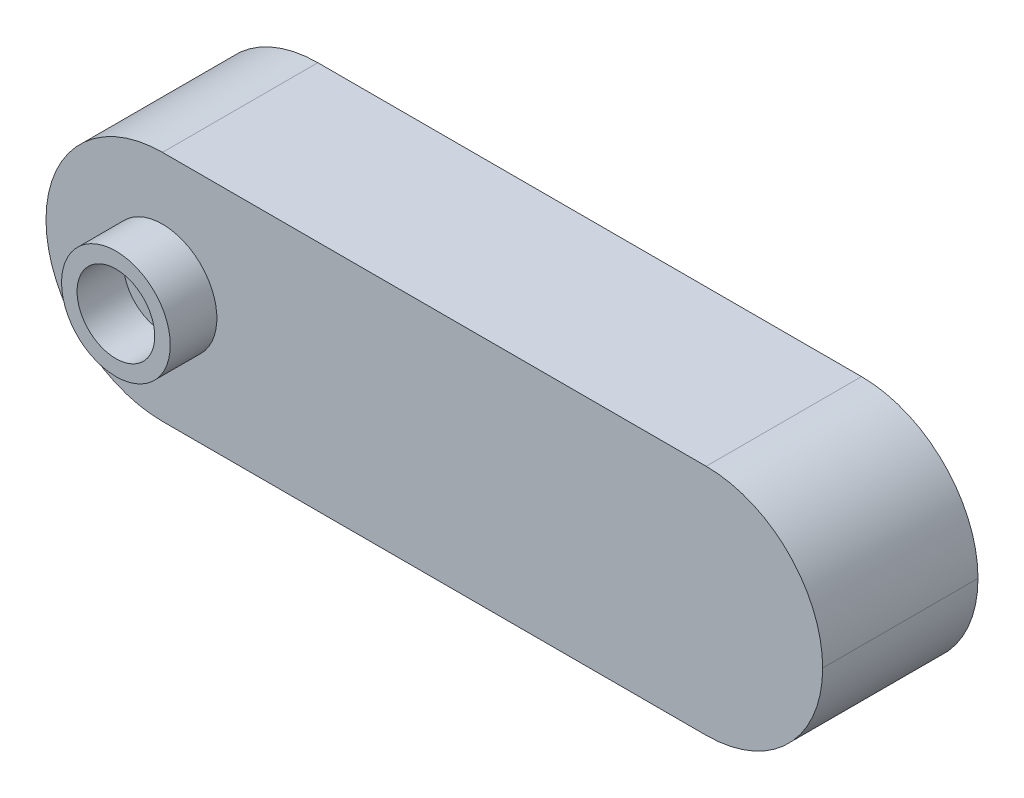
ISO-10303-21;
HEADER;
FILE_DESCRIPTION(('STEP AP214'),'2;1');
FILE_NAME('part.step','',(''),(''),'','','');
FILE_SCHEMA(('AUTOMOTIVE_DESIGN { 1 0 10303 214 1 1 1 1 }'));
ENDSEC;
DATA;
#1=APPLICATION_CONTEXT('core data for automotive mechanical design processes');
#2=APPLICATION_PROTOCOL_DEFINITION('international standard','automotive_design',2000,#1);
#3=PRODUCT_CONTEXT('',#1,'mechanical');
#4=PRODUCT('Part','Part','',(#3));
#5=PRODUCT_RELATED_PRODUCT_CATEGORY('part','',(#4));
#6=PRODUCT_DEFINITION_FORMATION('','',#4);
#7=PRODUCT_DEFINITION_CONTEXT('part definition',#1,'design');
#8=PRODUCT_DEFINITION('design','',#6,#7);
#9=PRODUCT_DEFINITION_SHAPE('','',#8);
#10=(LENGTH_UNIT() NAMED_UNIT(*) SI_UNIT(.MILLI.,.METRE.));
#11=(NAMED_UNIT(*) PLANE_ANGLE_UNIT() SI_UNIT($,.RADIAN.));
#12=(NAMED_UNIT(*) SI_UNIT($,.STERADIAN.) SOLID_ANGLE_UNIT());
#13=UNCERTAINTY_MEASURE_WITH_UNIT(LENGTH_MEASURE(1.E-05),#10,'distance_accuracy_value','');
#14=(GEOMETRIC_REPRESENTATION_CONTEXT(3) GLOBAL_UNCERTAINTY_ASSIGNED_CONTEXT((#13)) GLOBAL_UNIT_ASSIGNED_CONTEXT((#10,
#11,#12)) REPRESENTATION_CONTEXT('',''));
#15=CARTESIAN_POINT('',(0.,0.,0.));
#16=DIRECTION('',(0.,0.,1.));
#17=DIRECTION('',(1.,0.,0.));
#18=AXIS2_PLACEMENT_3D('',#15,#16,#17);
#19=CARTESIAN_POINT('',(0.,0.,10.));
#20=DIRECTION('',(0.,1.,0.));
#21=DIRECTION('',(0.,0.,1.));
#22=AXIS2_PLACEMENT_3D('',#19,#20,#21);
#23=PLANE('',#22);
#24=DIRECTION('',(1.,0.,0.));
#25=VECTOR('',#24,1.);
#26=CARTESIAN_POINT('',(0.,0.,0.));
#27=LINE('',#26,#25);
#28=CARTESIAN_POINT('',(7.5,0.,0.));
#29=VERTEX_POINT('',#28);
#30=CARTESIAN_POINT('',(42.5,0.,0.));
#31=VERTEX_POINT('',#30);
#32=EDGE_CURVE('E105',#29,#31,#27,.T.);
#33=ORIENTED_EDGE('',*,*,#32,.T.);
#34=DIRECTION('',(0.,0.,-1.));
#35=VECTOR('',#34,1.);
#36=CARTESIAN_POINT('',(42.5,0.,10.));
#37=LINE('',#36,#35);
#38=CARTESIAN_POINT('',(42.5,0.,10.));
#39=VERTEX_POINT('',#38);
#40=EDGE_CURVE('E148',#31,#39,#37,.F.);
#41=ORIENTED_EDGE('',*,*,#40,.T.);
#42=DIRECTION('',(1.,0.,0.));
#43=VECTOR('',#42,1.);
#44=CARTESIAN_POINT('',(0.,0.,10.));
#45=LINE('',#44,#43);
#46=CARTESIAN_POINT('',(7.5,0.,10.));
#47=VERTEX_POINT('',#46);
#48=EDGE_CURVE('E163',#47,#39,#45,.T.);
#49=ORIENTED_EDGE('',*,*,#48,.F.);
#50=DIRECTION('',(0.,0.,-1.));
#51=VECTOR('',#50,1.);
#52=CARTESIAN_POINT('',(7.5,0.,10.));
#53=LINE('',#52,#51);
#54=EDGE_CURVE('E152',#47,#29,#53,.T.);
#55=ORIENTED_EDGE('',*,*,#54,.T.);
#56=EDGE_LOOP('',(#33,#41,#49,#55));
#57=FACE_BOUND('',#56,.T.);
#58=ADVANCED_FACE('F45',(#57),#23,.F.);
#59=CARTESIAN_POINT('',(0.,15.,10.));
#60=DIRECTION('',(0.,-1.,0.));
#61=DIRECTION('',(0.,0.,-1.));
#62=AXIS2_PLACEMENT_3D('',#59,#60,#61);
#63=PLANE('',#62);
#64=DIRECTION('',(-1.,0.,0.));
#65=VECTOR('',#64,1.);
#66=CARTESIAN_POINT('',(0.,15.,10.));
#67=LINE('',#66,#65);
#68=CARTESIAN_POINT('',(42.5,15.,10.));
#69=VERTEX_POINT('',#68);
#70=CARTESIAN_POINT('',(7.5,15.,10.));
#71=VERTEX_POINT('',#70);
#72=EDGE_CURVE('E119',#69,#71,#67,.T.);
#73=ORIENTED_EDGE('',*,*,#72,.F.);
#74=DIRECTION('',(0.,0.,-1.));
#75=VECTOR('',#74,1.);
#76=CARTESIAN_POINT('',(42.5,15.,10.));
#77=LINE('',#76,#75);
#78=CARTESIAN_POINT('',(42.5,15.,0.));
#79=VERTEX_POINT('',#78);
#80=EDGE_CURVE('E54',#69,#79,#77,.T.);
#81=ORIENTED_EDGE('',*,*,#80,.T.);
#82=DIRECTION('',(-1.,0.,0.));
#83=VECTOR('',#82,1.);
#84=CARTESIAN_POINT('',(0.,15.,0.));
#85=LINE('',#84,#83);
#86=CARTESIAN_POINT('',(7.5,15.,0.));
#87=VERTEX_POINT('',#86);
#88=EDGE_CURVE('E160',#79,#87,#85,.T.);
#89=ORIENTED_EDGE('',*,*,#88,.T.);
#90=DIRECTION('',(0.,0.,-1.));
#91=VECTOR('',#90,1.);
#92=CARTESIAN_POINT('',(7.5,15.,10.));
#93=LINE('',#92,#91);
#94=EDGE_CURVE('E61',#87,#71,#93,.F.);
#95=ORIENTED_EDGE('',*,*,#94,.T.);
#96=EDGE_LOOP('',(#73,#81,#89,#95));
#97=FACE_BOUND('',#96,.T.);
#98=ADVANCED_FACE('F196',(#97),#63,.F.);
#99=CARTESIAN_POINT('',(0.,0.,10.));
#100=DIRECTION('',(0.,0.,-1.));
#101=DIRECTION('',(-1.,0.,0.));
#102=AXIS2_PLACEMENT_3D('',#99,#100,#101);
#103=PLANE('',#102);
#104=CARTESIAN_POINT('',(7.5,7.5,10.));
#105=DIRECTION('',(0.,0.,-1.));
#106=DIRECTION('',(-1.,0.,0.));
#107=AXIS2_PLACEMENT_3D('',#104,#105,#106);
#108=CIRCLE('',#107,3.5);
#109=CARTESIAN_POINT('',(4.,7.5,10.));
#110=VERTEX_POINT('',#109);
#111=EDGE_CURVE('E11',#110,#110,#108,.F.);
#112=ORIENTED_EDGE('',*,*,#111,.F.);
#113=EDGE_LOOP('',(#112));
#114=FACE_BOUND('',#113,.T.);
#115=ORIENTED_EDGE('',*,*,#48,.T.);
#116=CARTESIAN_POINT('',(42.5,7.5,10.));
#117=DIRECTION('',(0.,0.,-1.));
#118=DIRECTION('',(-1.,0.,0.));
#119=AXIS2_PLACEMENT_3D('',#116,#117,#118);
#120=CIRCLE('',#119,7.5);
#121=CARTESIAN_POINT('',(50.,7.5,10.));
#122=VERTEX_POINT('',#121);
#123=EDGE_CURVE('E138',#39,#122,#120,.F.);
#124=ORIENTED_EDGE('',*,*,#123,.T.);
#125=CARTESIAN_POINT('',(42.5,7.5,10.));
#126=DIRECTION('',(0.,0.,-1.));
#127=DIRECTION('',(-1.,0.,0.));
#128=AXIS2_PLACEMENT_3D('',#125,#126,#127);
#129=CIRCLE('',#128,7.5);
#130=EDGE_CURVE('E68',#122,#69,#129,.F.);
#131=ORIENTED_EDGE('',*,*,#130,.T.);
#132=ORIENTED_EDGE('',*,*,#72,.T.);
#133=CARTESIAN_POINT('',(7.5,7.5,10.));
#134=DIRECTION('',(0.,0.,-1.));
#135=DIRECTION('',(-1.,0.,0.));
#136=AXIS2_PLACEMENT_3D('',#133,#134,#135);
#137=CIRCLE('',#136,7.5);
#138=CARTESIAN_POINT('',(0.,7.5,10.));
#139=VERTEX_POINT('',#138);
#140=EDGE_CURVE('E145',#71,#139,#137,.F.);
#141=ORIENTED_EDGE('',*,*,#140,.T.);
#142=CARTESIAN_POINT('',(7.5,7.5,10.));
#143=DIRECTION('',(0.,0.,-1.));
#144=DIRECTION('',(-1.,0.,0.));
#145=AXIS2_PLACEMENT_3D('',#142,#143,#144);
#146=CIRCLE('',#145,7.5);
#147=EDGE_CURVE('E122',#139,#47,#146,.F.);
#148=ORIENTED_EDGE('',*,*,#147,.T.);
#149=EDGE_LOOP('',(#115,#124,#131,#132,#141,#148));
#150=FACE_BOUND('',#149,.T.);
#151=ADVANCED_FACE('F202',(#114,#150),#103,.F.);
#152=CARTESIAN_POINT('',(0.,0.,0.));
#153=DIRECTION('',(0.,0.,-1.));
#154=DIRECTION('',(-1.,0.,0.));
#155=AXIS2_PLACEMENT_3D('',#152,#153,#154);
#156=PLANE('',#155);
#157=CARTESIAN_POINT('',(42.5,7.5,0.));
#158=DIRECTION('',(0.,0.,-1.));
#159=DIRECTION('',(-1.,0.,0.));
#160=AXIS2_PLACEMENT_3D('',#157,#158,#159);
#161=CIRCLE('',#160,7.5);
#162=CARTESIAN_POINT('',(50.,7.5,0.));
#163=VERTEX_POINT('',#162);
#164=EDGE_CURVE('E111',#79,#163,#161,.T.);
#165=ORIENTED_EDGE('',*,*,#164,.T.);
#166=CARTESIAN_POINT('',(42.5,7.5,0.));
#167=DIRECTION('',(0.,0.,-1.));
#168=DIRECTION('',(-1.,0.,0.));
#169=AXIS2_PLACEMENT_3D('',#166,#167,#168);
#170=CIRCLE('',#169,7.5);
#171=EDGE_CURVE('E155',#163,#31,#170,.T.);
#172=ORIENTED_EDGE('',*,*,#171,.T.);
#173=ORIENTED_EDGE('',*,*,#32,.F.);
#174=CARTESIAN_POINT('',(7.5,7.5,0.));
#175=DIRECTION('',(0.,0.,-1.));
#176=DIRECTION('',(-1.,0.,0.));
#177=AXIS2_PLACEMENT_3D('',#174,#175,#176);
#178=CIRCLE('',#177,7.5);
#179=CARTESIAN_POINT('',(0.,7.5,0.));
#180=VERTEX_POINT('',#179);
#181=EDGE_CURVE('E99',#29,#180,#178,.T.);
#182=ORIENTED_EDGE('',*,*,#181,.T.);
#183=CARTESIAN_POINT('',(7.5,7.5,0.));
#184=DIRECTION('',(0.,0.,-1.));
#185=DIRECTION('',(-1.,0.,0.));
#186=AXIS2_PLACEMENT_3D('',#183,#184,#185);
#187=CIRCLE('',#186,7.5);
#188=EDGE_CURVE('E103',#180,#87,#187,.T.);
#189=ORIENTED_EDGE('',*,*,#188,.T.);
#190=ORIENTED_EDGE('',*,*,#88,.F.);
#191=EDGE_LOOP('',(#165,#172,#173,#182,#189,#190));
#192=FACE_BOUND('',#191,.T.);
#193=ADVANCED_FACE('F101',(#192),#156,.T.);
#194=CARTESIAN_POINT('',(42.5,7.5,10.));
#195=DIRECTION('',(0.,0.,-1.));
#196=DIRECTION('',(-1.,0.,0.));
#197=AXIS2_PLACEMENT_3D('',#194,#195,#196);
#198=CYLINDRICAL_SURFACE('',#197,7.5);
#199=ORIENTED_EDGE('',*,*,#80,.F.);
#200=ORIENTED_EDGE('',*,*,#130,.F.);
#201=DIRECTION('',(0.,0.,-1.));
#202=VECTOR('',#201,1.);
#203=CARTESIAN_POINT('',(50.,7.5,10.));
#204=LINE('',#203,#202);
#205=EDGE_CURVE('E124',#163,#122,#204,.F.);
#206=ORIENTED_EDGE('',*,*,#205,.F.);
#207=ORIENTED_EDGE('',*,*,#164,.F.);
#208=EDGE_LOOP('',(#199,#200,#206,#207));
#209=FACE_BOUND('',#208,.T.);
#210=ADVANCED_FACE('F209',(#209),#198,.T.);
#211=CARTESIAN_POINT('',(42.5,7.5,10.));
#212=DIRECTION('',(0.,0.,-1.));
#213=DIRECTION('',(-1.,0.,0.));
#214=AXIS2_PLACEMENT_3D('',#211,#212,#213);
#215=CYLINDRICAL_SURFACE('',#214,7.5);
#216=ORIENTED_EDGE('',*,*,#123,.F.);
#217=ORIENTED_EDGE('',*,*,#40,.F.);
#218=ORIENTED_EDGE('',*,*,#171,.F.);
#219=ORIENTED_EDGE('',*,*,#205,.T.);
#220=EDGE_LOOP('',(#216,#217,#218,#219));
#221=FACE_BOUND('',#220,.T.);
#222=ADVANCED_FACE('F206',(#221),#215,.T.);
#223=CARTESIAN_POINT('',(7.5,7.5,10.));
#224=DIRECTION('',(0.,0.,-1.));
#225=DIRECTION('',(-1.,0.,0.));
#226=AXIS2_PLACEMENT_3D('',#223,#224,#225);
#227=CYLINDRICAL_SURFACE('',#226,7.5);
#228=DIRECTION('',(0.,0.,-1.));
#229=VECTOR('',#228,1.);
#230=CARTESIAN_POINT('',(0.,7.5,10.));
#231=LINE('',#230,#229);
#232=EDGE_CURVE('E116',#139,#180,#231,.T.);
#233=ORIENTED_EDGE('',*,*,#232,.F.);
#234=ORIENTED_EDGE('',*,*,#140,.F.);
#235=ORIENTED_EDGE('',*,*,#94,.F.);
#236=ORIENTED_EDGE('',*,*,#188,.F.);
#237=EDGE_LOOP('',(#233,#234,#235,#236));
#238=FACE_BOUND('',#237,.T.);
#239=ADVANCED_FACE('F47',(#238),#227,.T.);
#240=CARTESIAN_POINT('',(7.5,7.5,10.));
#241=DIRECTION('',(0.,0.,-1.));
#242=DIRECTION('',(-1.,0.,0.));
#243=AXIS2_PLACEMENT_3D('',#240,#241,#242);
#244=CYLINDRICAL_SURFACE('',#243,7.5);
#245=ORIENTED_EDGE('',*,*,#147,.F.);
#246=ORIENTED_EDGE('',*,*,#232,.T.);
#247=ORIENTED_EDGE('',*,*,#181,.F.);
#248=ORIENTED_EDGE('',*,*,#54,.F.);
#249=EDGE_LOOP('',(#245,#246,#247,#248));
#250=FACE_BOUND('',#249,.T.);
#251=ADVANCED_FACE('F121',(#250),#244,.T.);
#252=CARTESIAN_POINT('',(7.5,7.5,13.));
#253=DIRECTION('',(0.,0.,1.));
#254=DIRECTION('',(1.,0.,0.));
#255=AXIS2_PLACEMENT_3D('',#252,#253,#254);
#256=PLANE('',#255);
#257=CARTESIAN_POINT('',(7.5,7.5,13.));
#258=DIRECTION('',(0.,0.,1.));
#259=DIRECTION('',(1.,0.,0.));
#260=AXIS2_PLACEMENT_3D('',#257,#258,#259);
#261=CIRCLE('',#260,3.5);
#262=CARTESIAN_POINT('',(11.,7.5,13.));
#263=VERTEX_POINT('',#262);
#264=EDGE_CURVE('E125',#263,#263,#261,.T.);
#265=ORIENTED_EDGE('',*,*,#264,.T.);
#266=EDGE_LOOP('',(#265));
#267=FACE_BOUND('',#266,.T.);
#268=CARTESIAN_POINT('',(7.5,7.5,13.));
#269=DIRECTION('',(0.,0.,1.));
#270=DIRECTION('',(1.,0.,0.));
#271=AXIS2_PLACEMENT_3D('',#268,#269,#270);
#272=CIRCLE('',#271,2.5);
#273=CARTESIAN_POINT('',(10.,7.5,13.));
#274=VERTEX_POINT('',#273);
#275=EDGE_CURVE('E131',#274,#274,#272,.T.);
#276=ORIENTED_EDGE('',*,*,#275,.F.);
#277=EDGE_LOOP('',(#276));
#278=FACE_BOUND('',#277,.T.);
#279=ADVANCED_FACE('F182',(#267,#278),#256,.T.);
#280=CARTESIAN_POINT('',(7.5,7.5,13.));
#281=DIRECTION('',(0.,0.,-1.));
#282=DIRECTION('',(-1.,0.,0.));
#283=AXIS2_PLACEMENT_3D('',#280,#281,#282);
#284=CYLINDRICAL_SURFACE('',#283,3.5);
#285=ORIENTED_EDGE('',*,*,#264,.F.);
#286=EDGE_LOOP('',(#285));
#287=FACE_BOUND('',#286,.T.);
#288=ORIENTED_EDGE('',*,*,#111,.T.);
#289=EDGE_LOOP('',(#288));
#290=FACE_BOUND('',#289,.T.);
#291=ADVANCED_FACE('F184',(#287,#290),#284,.T.);
#292=CARTESIAN_POINT('',(7.5,7.5,13.));
#293=DIRECTION('',(0.,0.,-1.));
#294=DIRECTION('',(-1.,0.,0.));
#295=AXIS2_PLACEMENT_3D('',#292,#293,#294);
#296=CYLINDRICAL_SURFACE('',#295,2.5);
#297=ORIENTED_EDGE('',*,*,#275,.T.);
#298=EDGE_LOOP('',(#297));
#299=FACE_BOUND('',#298,.T.);
#300=CARTESIAN_POINT('',(7.5,7.5,10.));
#301=DIRECTION('',(0.,0.,1.));
#302=DIRECTION('',(1.,0.,0.));
#303=AXIS2_PLACEMENT_3D('',#300,#301,#302);
#304=CIRCLE('',#303,2.5);
#305=CARTESIAN_POINT('',(10.,7.5,10.));
#306=VERTEX_POINT('',#305);
#307=EDGE_CURVE('E171',#306,#306,#304,.T.);
#308=ORIENTED_EDGE('',*,*,#307,.F.);
#309=EDGE_LOOP('',(#308));
#310=FACE_BOUND('',#309,.T.);
#311=ADVANCED_FACE('F179',(#299,#310),#296,.F.);
#312=ORIENTED_EDGE('',*,*,#307,.T.);
#313=EDGE_LOOP('',(#312));
#314=FACE_BOUND('',#313,.T.);
#315=ADVANCED_FACE('F224',(#314),#103,.F.);
#316=CLOSED_SHELL('',(#58,#98,#151,#193,#210,#222,#239,#251,#279,#291,#311,#315));
#317=MANIFOLD_SOLID_BREP('B2',#316);
#318=ADVANCED_BREP_SHAPE_REPRESENTATION('',(#18,#317),#14);
#319=SHAPE_DEFINITION_REPRESENTATION(#9,#318);
ENDSEC;
END-ISO-10303-21;
